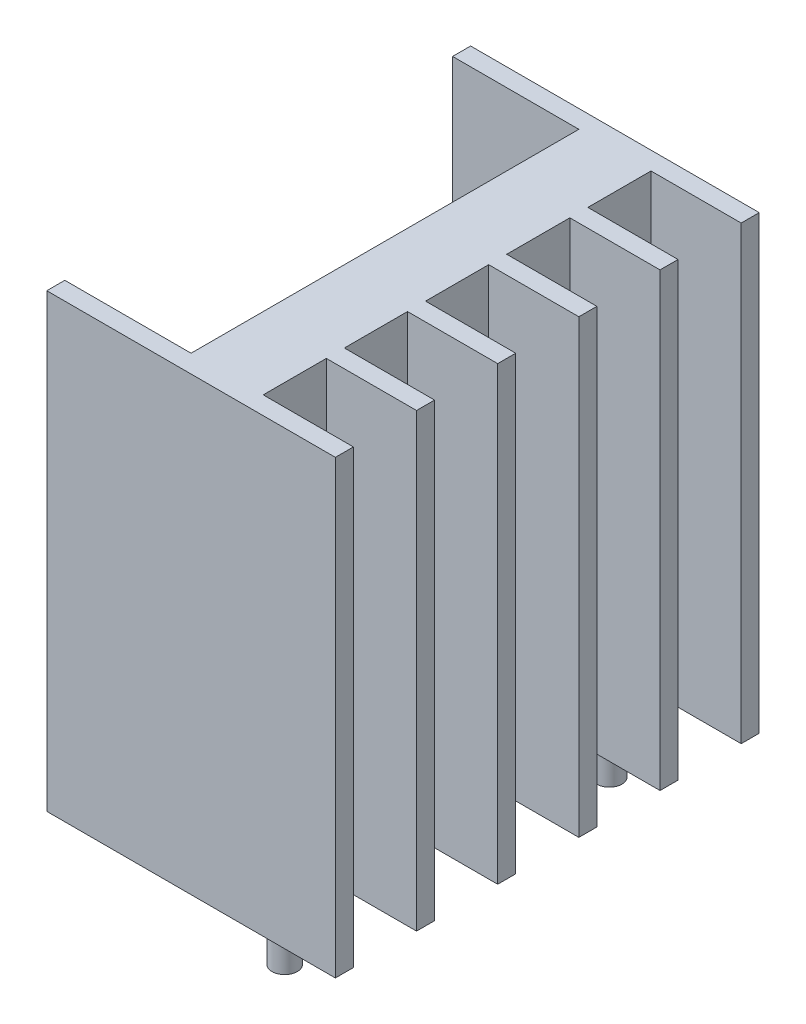
ISO-10303-21;
HEADER;
FILE_DESCRIPTION(('STEP AP214'),'2;1');
FILE_NAME('part.step','',(''),(''),'','','');
FILE_SCHEMA(('AUTOMOTIVE_DESIGN { 1 0 10303 214 1 1 1 1 }'));
ENDSEC;
DATA;
#1=APPLICATION_CONTEXT('core data for automotive mechanical design processes');
#2=APPLICATION_PROTOCOL_DEFINITION('international standard','automotive_design',2000,#1);
#3=PRODUCT_CONTEXT('',#1,'mechanical');
#4=PRODUCT('Part','Part','',(#3));
#5=PRODUCT_RELATED_PRODUCT_CATEGORY('part','',(#4));
#6=PRODUCT_DEFINITION_FORMATION('','',#4);
#7=PRODUCT_DEFINITION_CONTEXT('part definition',#1,'design');
#8=PRODUCT_DEFINITION('design','',#6,#7);
#9=PRODUCT_DEFINITION_SHAPE('','',#8);
#10=(LENGTH_UNIT() NAMED_UNIT(*) SI_UNIT(.MILLI.,.METRE.));
#11=(NAMED_UNIT(*) PLANE_ANGLE_UNIT() SI_UNIT($,.RADIAN.));
#12=(NAMED_UNIT(*) SI_UNIT($,.STERADIAN.) SOLID_ANGLE_UNIT());
#13=UNCERTAINTY_MEASURE_WITH_UNIT(LENGTH_MEASURE(1.E-05),#10,'distance_accuracy_value','');
#14=(GEOMETRIC_REPRESENTATION_CONTEXT(3) GLOBAL_UNCERTAINTY_ASSIGNED_CONTEXT((#13)) GLOBAL_UNIT_ASSIGNED_CONTEXT((#10,
#11,#12)) REPRESENTATION_CONTEXT('',''));
#15=CARTESIAN_POINT('',(0.,0.,0.));
#16=DIRECTION('',(0.,0.,1.));
#17=DIRECTION('',(1.,0.,0.));
#18=AXIS2_PLACEMENT_3D('',#15,#16,#17);
#19=CARTESIAN_POINT('',(2.,25.,-11.75));
#20=DIRECTION('',(-1.,0.,0.));
#21=DIRECTION('',(0.,0.,1.));
#22=AXIS2_PLACEMENT_3D('',#19,#20,#21);
#23=PLANE('',#22);
#24=DIRECTION('',(0.,0.,-1.));
#25=VECTOR('',#24,1.);
#26=CARTESIAN_POINT('',(2.,25.,-11.75));
#27=LINE('',#26,#25);
#28=CARTESIAN_POINT('',(2.,25.,6.25));
#29=VERTEX_POINT('',#28);
#30=CARTESIAN_POINT('',(2.,25.,2.75));
#31=VERTEX_POINT('',#30);
#32=EDGE_CURVE('E450',#29,#31,#27,.T.);
#33=ORIENTED_EDGE('',*,*,#32,.F.);
#34=DIRECTION('',(0.,1.,0.));
#35=VECTOR('',#34,1.);
#36=CARTESIAN_POINT('',(2.,-7.07106781186548,6.25));
#37=LINE('',#36,#35);
#38=CARTESIAN_POINT('',(2.,0.,6.25));
#39=VERTEX_POINT('',#38);
#40=EDGE_CURVE('E282',#39,#29,#37,.T.);
#41=ORIENTED_EDGE('',*,*,#40,.F.);
#42=DIRECTION('',(0.,0.,-1.));
#43=VECTOR('',#42,1.);
#44=CARTESIAN_POINT('',(2.,0.,-11.75));
#45=LINE('',#44,#43);
#46=CARTESIAN_POINT('',(2.,0.,2.75));
#47=VERTEX_POINT('',#46);
#48=EDGE_CURVE('E473',#39,#47,#45,.T.);
#49=ORIENTED_EDGE('',*,*,#48,.T.);
#50=DIRECTION('',(0.,1.,0.));
#51=VECTOR('',#50,1.);
#52=CARTESIAN_POINT('',(2.,-7.07106781186548,2.75));
#53=LINE('',#52,#51);
#54=EDGE_CURVE('E300',#47,#31,#53,.T.);
#55=ORIENTED_EDGE('',*,*,#54,.T.);
#56=EDGE_LOOP('',(#33,#41,#49,#55));
#57=FACE_BOUND('',#56,.T.);
#58=ADVANCED_FACE('F37',(#57),#23,.F.);
#59=CARTESIAN_POINT('',(2.,18.,0.));
#60=DIRECTION('',(-1.,0.,0.));
#61=DIRECTION('',(0.,0.,1.));
#62=AXIS2_PLACEMENT_3D('',#59,#60,#61);
#63=CIRCLE('',#62,1.6);
#64=CARTESIAN_POINT('',(2.,18.,1.6));
#65=VERTEX_POINT('',#64);
#66=EDGE_CURVE('E268',#65,#65,#63,.T.);
#67=ORIENTED_EDGE('',*,*,#66,.T.);
#68=EDGE_LOOP('',(#67));
#69=FACE_BOUND('',#68,.T.);
#70=CARTESIAN_POINT('',(2.,25.,1.75));
#71=VERTEX_POINT('',#70);
#72=CARTESIAN_POINT('',(2.,25.,-1.75));
#73=VERTEX_POINT('',#72);
#74=EDGE_CURVE('E466',#71,#73,#27,.T.);
#75=ORIENTED_EDGE('',*,*,#74,.F.);
#76=DIRECTION('',(0.,1.,0.));
#77=VECTOR('',#76,1.);
#78=CARTESIAN_POINT('',(2.,-7.07106781186548,1.75));
#79=LINE('',#78,#77);
#80=CARTESIAN_POINT('',(2.,0.,1.75));
#81=VERTEX_POINT('',#80);
#82=EDGE_CURVE('E308',#81,#71,#79,.T.);
#83=ORIENTED_EDGE('',*,*,#82,.F.);
#84=CARTESIAN_POINT('',(2.,0.,-1.75));
#85=VERTEX_POINT('',#84);
#86=EDGE_CURVE('E490',#81,#85,#45,.T.);
#87=ORIENTED_EDGE('',*,*,#86,.T.);
#88=DIRECTION('',(0.,1.,0.));
#89=VECTOR('',#88,1.);
#90=CARTESIAN_POINT('',(2.,-7.07106781186548,-1.75));
#91=LINE('',#90,#89);
#92=EDGE_CURVE('E326',#85,#73,#91,.T.);
#93=ORIENTED_EDGE('',*,*,#92,.T.);
#94=EDGE_LOOP('',(#75,#83,#87,#93));
#95=FACE_BOUND('',#94,.T.);
#96=ADVANCED_FACE('F489',(#69,#95),#23,.F.);
#97=CARTESIAN_POINT('',(2.,25.,-2.75));
#98=VERTEX_POINT('',#97);
#99=CARTESIAN_POINT('',(2.,25.,-6.25));
#100=VERTEX_POINT('',#99);
#101=EDGE_CURVE('E464',#98,#100,#27,.T.);
#102=ORIENTED_EDGE('',*,*,#101,.F.);
#103=DIRECTION('',(0.,1.,0.));
#104=VECTOR('',#103,1.);
#105=CARTESIAN_POINT('',(2.,-7.07106781186548,-2.75));
#106=LINE('',#105,#104);
#107=CARTESIAN_POINT('',(2.,0.,-2.75));
#108=VERTEX_POINT('',#107);
#109=EDGE_CURVE('E334',#108,#98,#106,.T.);
#110=ORIENTED_EDGE('',*,*,#109,.F.);
#111=CARTESIAN_POINT('',(2.,0.,-6.25));
#112=VERTEX_POINT('',#111);
#113=EDGE_CURVE('E507',#108,#112,#45,.T.);
#114=ORIENTED_EDGE('',*,*,#113,.T.);
#115=DIRECTION('',(0.,1.,0.));
#116=VECTOR('',#115,1.);
#117=CARTESIAN_POINT('',(2.,-7.07106781186548,-6.25));
#118=LINE('',#117,#116);
#119=EDGE_CURVE('E352',#112,#100,#118,.T.);
#120=ORIENTED_EDGE('',*,*,#119,.T.);
#121=EDGE_LOOP('',(#102,#110,#114,#120));
#122=FACE_BOUND('',#121,.T.);
#123=ADVANCED_FACE('F506',(#122),#23,.F.);
#124=CARTESIAN_POINT('',(2.,25.,-7.25));
#125=VERTEX_POINT('',#124);
#126=CARTESIAN_POINT('',(2.,25.,-10.75));
#127=VERTEX_POINT('',#126);
#128=EDGE_CURVE('E451',#125,#127,#27,.T.);
#129=ORIENTED_EDGE('',*,*,#128,.F.);
#130=DIRECTION('',(0.,1.,0.));
#131=VECTOR('',#130,1.);
#132=CARTESIAN_POINT('',(2.,-7.07106781186548,-7.25));
#133=LINE('',#132,#131);
#134=CARTESIAN_POINT('',(2.,0.,-7.25));
#135=VERTEX_POINT('',#134);
#136=EDGE_CURVE('E360',#135,#125,#133,.T.);
#137=ORIENTED_EDGE('',*,*,#136,.F.);
#138=CARTESIAN_POINT('',(2.,0.,-8.58165069778209));
#139=VERTEX_POINT('',#138);
#140=EDGE_CURVE('E238',#135,#139,#45,.T.);
#141=ORIENTED_EDGE('',*,*,#140,.T.);
#142=CARTESIAN_POINT('',(2.,0.,-9.4183493022179));
#143=VERTEX_POINT('',#142);
#144=EDGE_CURVE('E232',#139,#143,#45,.T.);
#145=ORIENTED_EDGE('',*,*,#144,.T.);
#146=CARTESIAN_POINT('',(2.,0.,-10.75));
#147=VERTEX_POINT('',#146);
#148=EDGE_CURVE('E235',#143,#147,#45,.T.);
#149=ORIENTED_EDGE('',*,*,#148,.T.);
#150=DIRECTION('',(0.,1.,0.));
#151=VECTOR('',#150,1.);
#152=CARTESIAN_POINT('',(2.,-7.07106781186548,-10.75));
#153=LINE('',#152,#151);
#154=EDGE_CURVE('E376',#147,#127,#153,.T.);
#155=ORIENTED_EDGE('',*,*,#154,.T.);
#156=EDGE_LOOP('',(#129,#137,#141,#145,#149,#155));
#157=FACE_BOUND('',#156,.T.);
#158=ADVANCED_FACE('F233',(#157),#23,.F.);
#159=CARTESIAN_POINT('',(2.,0.,10.75));
#160=VERTEX_POINT('',#159);
#161=CARTESIAN_POINT('',(2.,0.,9.4183493022179));
#162=VERTEX_POINT('',#161);
#163=EDGE_CURVE('E249',#160,#162,#45,.T.);
#164=ORIENTED_EDGE('',*,*,#163,.T.);
#165=CARTESIAN_POINT('',(2.,0.,8.5816506977821));
#166=VERTEX_POINT('',#165);
#167=EDGE_CURVE('E458',#162,#166,#45,.T.);
#168=ORIENTED_EDGE('',*,*,#167,.T.);
#169=CARTESIAN_POINT('',(2.,0.,7.25));
#170=VERTEX_POINT('',#169);
#171=EDGE_CURVE('E243',#166,#170,#45,.T.);
#172=ORIENTED_EDGE('',*,*,#171,.T.);
#173=DIRECTION('',(0.,1.,0.));
#174=VECTOR('',#173,1.);
#175=CARTESIAN_POINT('',(2.,-7.07106781186548,7.25));
#176=LINE('',#175,#174);
#177=CARTESIAN_POINT('',(2.,25.,7.25));
#178=VERTEX_POINT('',#177);
#179=EDGE_CURVE('E275',#170,#178,#176,.T.);
#180=ORIENTED_EDGE('',*,*,#179,.T.);
#181=CARTESIAN_POINT('',(2.,25.,10.75));
#182=VERTEX_POINT('',#181);
#183=EDGE_CURVE('E446',#182,#178,#27,.T.);
#184=ORIENTED_EDGE('',*,*,#183,.F.);
#185=DIRECTION('',(0.,1.,0.));
#186=VECTOR('',#185,1.);
#187=CARTESIAN_POINT('',(2.,-7.07106781186548,10.75));
#188=LINE('',#187,#186);
#189=EDGE_CURVE('E432',#160,#182,#188,.T.);
#190=ORIENTED_EDGE('',*,*,#189,.F.);
#191=EDGE_LOOP('',(#164,#168,#172,#180,#184,#190));
#192=FACE_BOUND('',#191,.T.);
#193=ADVANCED_FACE('F39',(#192),#23,.F.);
#194=CARTESIAN_POINT('',(-2.,25.,-11.75));
#195=DIRECTION('',(0.,0.,1.));
#196=DIRECTION('',(1.,0.,0.));
#197=AXIS2_PLACEMENT_3D('',#194,#195,#196);
#198=PLANE('',#197);
#199=DIRECTION('',(-1.,0.,0.));
#200=VECTOR('',#199,1.);
#201=CARTESIAN_POINT('',(-2.,0.,-11.75));
#202=LINE('',#201,#200);
#203=CARTESIAN_POINT('',(7.,0.,-11.75));
#204=VERTEX_POINT('',#203);
#205=CARTESIAN_POINT('',(-9.,0.,-11.75));
#206=VERTEX_POINT('',#205);
#207=EDGE_CURVE('E457',#204,#206,#202,.T.);
#208=ORIENTED_EDGE('',*,*,#207,.T.);
#209=DIRECTION('',(0.,1.,0.));
#210=VECTOR('',#209,1.);
#211=CARTESIAN_POINT('',(-9.,-7.07106781186548,-11.75));
#212=LINE('',#211,#210);
#213=CARTESIAN_POINT('',(-9.,25.,-11.75));
#214=VERTEX_POINT('',#213);
#215=EDGE_CURVE('E391',#206,#214,#212,.T.);
#216=ORIENTED_EDGE('',*,*,#215,.T.);
#217=DIRECTION('',(-1.,0.,0.));
#218=VECTOR('',#217,1.);
#219=CARTESIAN_POINT('',(-2.,25.,-11.75));
#220=LINE('',#219,#218);
#221=CARTESIAN_POINT('',(7.,25.,-11.75));
#222=VERTEX_POINT('',#221);
#223=EDGE_CURVE('E449',#222,#214,#220,.T.);
#224=ORIENTED_EDGE('',*,*,#223,.F.);
#225=DIRECTION('',(0.,1.,0.));
#226=VECTOR('',#225,1.);
#227=CARTESIAN_POINT('',(7.,-7.07106781186548,-11.75));
#228=LINE('',#227,#226);
#229=EDGE_CURVE('E381',#204,#222,#228,.T.);
#230=ORIENTED_EDGE('',*,*,#229,.F.);
#231=EDGE_LOOP('',(#208,#216,#224,#230));
#232=FACE_BOUND('',#231,.T.);
#233=ADVANCED_FACE('F531',(#232),#198,.F.);
#234=CARTESIAN_POINT('',(-2.,25.,-11.75));
#235=DIRECTION('',(1.,0.,0.));
#236=DIRECTION('',(0.,0.,-1.));
#237=AXIS2_PLACEMENT_3D('',#234,#235,#236);
#238=PLANE('',#237);
#239=CARTESIAN_POINT('',(-2.,18.,0.));
#240=DIRECTION('',(-1.,0.,0.));
#241=DIRECTION('',(0.,0.,1.));
#242=AXIS2_PLACEMENT_3D('',#239,#240,#241);
#243=CIRCLE('',#242,1.6);
#244=CARTESIAN_POINT('',(-2.,18.,1.6));
#245=VERTEX_POINT('',#244);
#246=EDGE_CURVE('E264',#245,#245,#243,.T.);
#247=ORIENTED_EDGE('',*,*,#246,.F.);
#248=EDGE_LOOP('',(#247));
#249=FACE_BOUND('',#248,.T.);
#250=DIRECTION('',(0.,0.,1.));
#251=VECTOR('',#250,1.);
#252=CARTESIAN_POINT('',(-2.,25.,-11.75));
#253=LINE('',#252,#251);
#254=CARTESIAN_POINT('',(-2.,25.,-10.75));
#255=VERTEX_POINT('',#254);
#256=CARTESIAN_POINT('',(-2.,25.,10.75));
#257=VERTEX_POINT('',#256);
#258=EDGE_CURVE('E453',#255,#257,#253,.T.);
#259=ORIENTED_EDGE('',*,*,#258,.F.);
#260=DIRECTION('',(0.,1.,0.));
#261=VECTOR('',#260,1.);
#262=CARTESIAN_POINT('',(-2.,-7.07106781186548,-10.75));
#263=LINE('',#262,#261);
#264=CARTESIAN_POINT('',(-2.,0.,-10.75));
#265=VERTEX_POINT('',#264);
#266=EDGE_CURVE('E397',#265,#255,#263,.T.);
#267=ORIENTED_EDGE('',*,*,#266,.F.);
#268=DIRECTION('',(0.,0.,1.));
#269=VECTOR('',#268,1.);
#270=CARTESIAN_POINT('',(-2.,0.,-11.75));
#271=LINE('',#270,#269);
#272=CARTESIAN_POINT('',(-2.,0.,10.75));
#273=VERTEX_POINT('',#272);
#274=EDGE_CURVE('E460',#265,#273,#271,.T.);
#275=ORIENTED_EDGE('',*,*,#274,.T.);
#276=DIRECTION('',(0.,1.,0.));
#277=VECTOR('',#276,1.);
#278=CARTESIAN_POINT('',(-2.,-7.07106781186548,10.75));
#279=LINE('',#278,#277);
#280=EDGE_CURVE('E413',#273,#257,#279,.T.);
#281=ORIENTED_EDGE('',*,*,#280,.T.);
#282=EDGE_LOOP('',(#259,#267,#275,#281));
#283=FACE_BOUND('',#282,.T.);
#284=ADVANCED_FACE('F544',(#249,#283),#238,.F.);
#285=CARTESIAN_POINT('',(-2.,25.,11.75));
#286=DIRECTION('',(0.,0.,-1.));
#287=DIRECTION('',(-1.,0.,0.));
#288=AXIS2_PLACEMENT_3D('',#285,#286,#287);
#289=PLANE('',#288);
#290=DIRECTION('',(1.,0.,0.));
#291=VECTOR('',#290,1.);
#292=CARTESIAN_POINT('',(-2.,0.,11.75));
#293=LINE('',#292,#291);
#294=CARTESIAN_POINT('',(-9.,0.,11.75));
#295=VERTEX_POINT('',#294);
#296=CARTESIAN_POINT('',(7.,0.,11.75));
#297=VERTEX_POINT('',#296);
#298=EDGE_CURVE('E461',#295,#297,#293,.T.);
#299=ORIENTED_EDGE('',*,*,#298,.T.);
#300=DIRECTION('',(0.,1.,0.));
#301=VECTOR('',#300,1.);
#302=CARTESIAN_POINT('',(7.,-7.07106781186548,11.75));
#303=LINE('',#302,#301);
#304=CARTESIAN_POINT('',(7.,25.,11.75));
#305=VERTEX_POINT('',#304);
#306=EDGE_CURVE('E439',#297,#305,#303,.T.);
#307=ORIENTED_EDGE('',*,*,#306,.T.);
#308=DIRECTION('',(1.,0.,0.));
#309=VECTOR('',#308,1.);
#310=CARTESIAN_POINT('',(-2.,25.,11.75));
#311=LINE('',#310,#309);
#312=CARTESIAN_POINT('',(-9.,25.,11.75));
#313=VERTEX_POINT('',#312);
#314=EDGE_CURVE('E455',#313,#305,#311,.T.);
#315=ORIENTED_EDGE('',*,*,#314,.F.);
#316=DIRECTION('',(0.,1.,0.));
#317=VECTOR('',#316,1.);
#318=CARTESIAN_POINT('',(-9.,-7.07106781186548,11.75));
#319=LINE('',#318,#317);
#320=EDGE_CURVE('E419',#295,#313,#319,.T.);
#321=ORIENTED_EDGE('',*,*,#320,.F.);
#322=EDGE_LOOP('',(#299,#307,#315,#321));
#323=FACE_BOUND('',#322,.T.);
#324=ADVANCED_FACE('F558',(#323),#289,.F.);
#325=CARTESIAN_POINT('',(0.,25.,0.));
#326=DIRECTION('',(0.,1.,0.));
#327=DIRECTION('',(0.,0.,1.));
#328=AXIS2_PLACEMENT_3D('',#325,#326,#327);
#329=PLANE('',#328);
#330=ORIENTED_EDGE('',*,*,#314,.T.);
#331=DIRECTION('',(0.,0.,-1.));
#332=VECTOR('',#331,1.);
#333=CARTESIAN_POINT('',(7.,25.,11.75));
#334=LINE('',#333,#332);
#335=CARTESIAN_POINT('',(7.,25.,10.75));
#336=VERTEX_POINT('',#335);
#337=EDGE_CURVE('E427',#305,#336,#334,.T.);
#338=ORIENTED_EDGE('',*,*,#337,.T.);
#339=DIRECTION('',(-1.,0.,0.));
#340=VECTOR('',#339,1.);
#341=CARTESIAN_POINT('',(2.,25.,10.75));
#342=LINE('',#341,#340);
#343=EDGE_CURVE('E436',#336,#182,#342,.T.);
#344=ORIENTED_EDGE('',*,*,#343,.T.);
#345=ORIENTED_EDGE('',*,*,#183,.T.);
#346=DIRECTION('',(1.,0.,0.));
#347=VECTOR('',#346,1.);
#348=CARTESIAN_POINT('',(2.,25.,7.25));
#349=LINE('',#348,#347);
#350=CARTESIAN_POINT('',(7.,25.,7.25));
#351=VERTEX_POINT('',#350);
#352=EDGE_CURVE('E291',#178,#351,#349,.T.);
#353=ORIENTED_EDGE('',*,*,#352,.T.);
#354=DIRECTION('',(0.,0.,-1.));
#355=VECTOR('',#354,1.);
#356=CARTESIAN_POINT('',(7.,25.,6.25));
#357=LINE('',#356,#355);
#358=CARTESIAN_POINT('',(7.,25.,6.25));
#359=VERTEX_POINT('',#358);
#360=EDGE_CURVE('E288',#351,#359,#357,.T.);
#361=ORIENTED_EDGE('',*,*,#360,.T.);
#362=DIRECTION('',(-1.,0.,0.));
#363=VECTOR('',#362,1.);
#364=CARTESIAN_POINT('',(2.,25.,6.25));
#365=LINE('',#364,#363);
#366=EDGE_CURVE('E277',#359,#29,#365,.T.);
#367=ORIENTED_EDGE('',*,*,#366,.T.);
#368=ORIENTED_EDGE('',*,*,#32,.T.);
#369=DIRECTION('',(1.,0.,0.));
#370=VECTOR('',#369,1.);
#371=CARTESIAN_POINT('',(2.,25.,2.75));
#372=LINE('',#371,#370);
#373=CARTESIAN_POINT('',(7.,25.,2.75));
#374=VERTEX_POINT('',#373);
#375=EDGE_CURVE('E317',#31,#374,#372,.T.);
#376=ORIENTED_EDGE('',*,*,#375,.T.);
#377=DIRECTION('',(0.,0.,-1.));
#378=VECTOR('',#377,1.);
#379=CARTESIAN_POINT('',(7.,25.,1.75));
#380=LINE('',#379,#378);
#381=CARTESIAN_POINT('',(7.,25.,1.75));
#382=VERTEX_POINT('',#381);
#383=EDGE_CURVE('E314',#374,#382,#380,.T.);
#384=ORIENTED_EDGE('',*,*,#383,.T.);
#385=DIRECTION('',(-1.,0.,0.));
#386=VECTOR('',#385,1.);
#387=CARTESIAN_POINT('',(2.,25.,1.75));
#388=LINE('',#387,#386);
#389=EDGE_CURVE('E303',#382,#71,#388,.T.);
#390=ORIENTED_EDGE('',*,*,#389,.T.);
#391=ORIENTED_EDGE('',*,*,#74,.T.);
#392=DIRECTION('',(1.,0.,0.));
#393=VECTOR('',#392,1.);
#394=CARTESIAN_POINT('',(2.,25.,-1.75));
#395=LINE('',#394,#393);
#396=CARTESIAN_POINT('',(7.,25.,-1.75));
#397=VERTEX_POINT('',#396);
#398=EDGE_CURVE('E343',#73,#397,#395,.T.);
#399=ORIENTED_EDGE('',*,*,#398,.T.);
#400=DIRECTION('',(0.,0.,-1.));
#401=VECTOR('',#400,1.);
#402=CARTESIAN_POINT('',(7.,25.,-2.75));
#403=LINE('',#402,#401);
#404=CARTESIAN_POINT('',(7.,25.,-2.75));
#405=VERTEX_POINT('',#404);
#406=EDGE_CURVE('E340',#397,#405,#403,.T.);
#407=ORIENTED_EDGE('',*,*,#406,.T.);
#408=DIRECTION('',(-1.,0.,0.));
#409=VECTOR('',#408,1.);
#410=CARTESIAN_POINT('',(2.,25.,-2.75));
#411=LINE('',#410,#409);
#412=EDGE_CURVE('E329',#405,#98,#411,.T.);
#413=ORIENTED_EDGE('',*,*,#412,.T.);
#414=ORIENTED_EDGE('',*,*,#101,.T.);
#415=DIRECTION('',(1.,0.,0.));
#416=VECTOR('',#415,1.);
#417=CARTESIAN_POINT('',(2.,25.,-6.25));
#418=LINE('',#417,#416);
#419=CARTESIAN_POINT('',(7.,25.,-6.25));
#420=VERTEX_POINT('',#419);
#421=EDGE_CURVE('E369',#100,#420,#418,.T.);
#422=ORIENTED_EDGE('',*,*,#421,.T.);
#423=DIRECTION('',(0.,0.,-1.));
#424=VECTOR('',#423,1.);
#425=CARTESIAN_POINT('',(7.,25.,-7.25));
#426=LINE('',#425,#424);
#427=CARTESIAN_POINT('',(7.,25.,-7.25));
#428=VERTEX_POINT('',#427);
#429=EDGE_CURVE('E366',#420,#428,#426,.T.);
#430=ORIENTED_EDGE('',*,*,#429,.T.);
#431=DIRECTION('',(-1.,0.,0.));
#432=VECTOR('',#431,1.);
#433=CARTESIAN_POINT('',(2.,25.,-7.25));
#434=LINE('',#433,#432);
#435=EDGE_CURVE('E355',#428,#125,#434,.T.);
#436=ORIENTED_EDGE('',*,*,#435,.T.);
#437=ORIENTED_EDGE('',*,*,#128,.T.);
#438=DIRECTION('',(1.,0.,0.));
#439=VECTOR('',#438,1.);
#440=CARTESIAN_POINT('',(2.,25.,-10.75));
#441=LINE('',#440,#439);
#442=CARTESIAN_POINT('',(7.,25.,-10.75));
#443=VERTEX_POINT('',#442);
#444=EDGE_CURVE('E386',#127,#443,#441,.T.);
#445=ORIENTED_EDGE('',*,*,#444,.T.);
#446=DIRECTION('',(0.,0.,-1.));
#447=VECTOR('',#446,1.);
#448=CARTESIAN_POINT('',(7.,25.,-11.75));
#449=LINE('',#448,#447);
#450=EDGE_CURVE('E378',#443,#222,#449,.T.);
#451=ORIENTED_EDGE('',*,*,#450,.T.);
#452=ORIENTED_EDGE('',*,*,#223,.T.);
#453=DIRECTION('',(0.,0.,1.));
#454=VECTOR('',#453,1.);
#455=CARTESIAN_POINT('',(-9.,25.,-11.75));
#456=LINE('',#455,#454);
#457=CARTESIAN_POINT('',(-9.,25.,-10.75));
#458=VERTEX_POINT('',#457);
#459=EDGE_CURVE('E403',#214,#458,#456,.T.);
#460=ORIENTED_EDGE('',*,*,#459,.T.);
#461=DIRECTION('',(1.,0.,0.));
#462=VECTOR('',#461,1.);
#463=CARTESIAN_POINT('',(-2.,25.,-10.75));
#464=LINE('',#463,#462);
#465=EDGE_CURVE('E394',#458,#255,#464,.T.);
#466=ORIENTED_EDGE('',*,*,#465,.T.);
#467=ORIENTED_EDGE('',*,*,#258,.T.);
#468=DIRECTION('',(-1.,0.,0.));
#469=VECTOR('',#468,1.);
#470=CARTESIAN_POINT('',(-2.,25.,10.75));
#471=LINE('',#470,#469);
#472=CARTESIAN_POINT('',(-9.,25.,10.75));
#473=VERTEX_POINT('',#472);
#474=EDGE_CURVE('E424',#257,#473,#471,.T.);
#475=ORIENTED_EDGE('',*,*,#474,.T.);
#476=DIRECTION('',(0.,0.,1.));
#477=VECTOR('',#476,1.);
#478=CARTESIAN_POINT('',(-9.,25.,11.75));
#479=LINE('',#478,#477);
#480=EDGE_CURVE('E416',#473,#313,#479,.T.);
#481=ORIENTED_EDGE('',*,*,#480,.T.);
#482=EDGE_LOOP('',(#330,#338,#344,#345,#353,#361,#367,#368,#376,#384,#390,#391,#399,#407,#413,
#414,#422,#430,#436,#437,#445,#451,#452,#460,#466,#467,#475,#481));
#483=FACE_BOUND('',#482,.T.);
#484=ADVANCED_FACE('F467',(#483),#329,.T.);
#485=CARTESIAN_POINT('',(0.,0.,0.));
#486=DIRECTION('',(0.,1.,0.));
#487=DIRECTION('',(0.,0.,1.));
#488=AXIS2_PLACEMENT_3D('',#485,#486,#487);
#489=PLANE('',#488);
#490=CARTESIAN_POINT('',(1.43876576963464,0.,-9.));
#491=DIRECTION('',(0.,1.,0.));
#492=DIRECTION('',(0.,0.,1.));
#493=AXIS2_PLACEMENT_3D('',#490,#491,#492);
#494=CIRCLE('',#493,0.7);
#495=EDGE_CURVE('E11',#139,#143,#494,.F.);
#496=ORIENTED_EDGE('',*,*,#495,.F.);
#497=ORIENTED_EDGE('',*,*,#140,.F.);
#498=DIRECTION('',(1.,0.,0.));
#499=VECTOR('',#498,1.);
#500=CARTESIAN_POINT('',(2.,0.,-7.25));
#501=LINE('',#500,#499);
#502=CARTESIAN_POINT('',(7.,0.,-7.25));
#503=VERTEX_POINT('',#502);
#504=EDGE_CURVE('E351',#135,#503,#501,.T.);
#505=ORIENTED_EDGE('',*,*,#504,.T.);
#506=DIRECTION('',(0.,0.,1.));
#507=VECTOR('',#506,1.);
#508=CARTESIAN_POINT('',(7.,0.,-7.25));
#509=LINE('',#508,#507);
#510=CARTESIAN_POINT('',(7.,0.,-6.25));
#511=VERTEX_POINT('',#510);
#512=EDGE_CURVE('E363',#503,#511,#509,.T.);
#513=ORIENTED_EDGE('',*,*,#512,.T.);
#514=DIRECTION('',(-1.,0.,0.));
#515=VECTOR('',#514,1.);
#516=CARTESIAN_POINT('',(2.,0.,-6.25));
#517=LINE('',#516,#515);
#518=EDGE_CURVE('E346',#511,#112,#517,.T.);
#519=ORIENTED_EDGE('',*,*,#518,.T.);
#520=ORIENTED_EDGE('',*,*,#113,.F.);
#521=DIRECTION('',(1.,0.,0.));
#522=VECTOR('',#521,1.);
#523=CARTESIAN_POINT('',(2.,0.,-2.75));
#524=LINE('',#523,#522);
#525=CARTESIAN_POINT('',(7.,0.,-2.75));
#526=VERTEX_POINT('',#525);
#527=EDGE_CURVE('E325',#108,#526,#524,.T.);
#528=ORIENTED_EDGE('',*,*,#527,.T.);
#529=DIRECTION('',(0.,0.,1.));
#530=VECTOR('',#529,1.);
#531=CARTESIAN_POINT('',(7.,0.,-2.75));
#532=LINE('',#531,#530);
#533=CARTESIAN_POINT('',(7.,0.,-1.75));
#534=VERTEX_POINT('',#533);
#535=EDGE_CURVE('E337',#526,#534,#532,.T.);
#536=ORIENTED_EDGE('',*,*,#535,.T.);
#537=DIRECTION('',(-1.,0.,0.));
#538=VECTOR('',#537,1.);
#539=CARTESIAN_POINT('',(2.,0.,-1.75));
#540=LINE('',#539,#538);
#541=EDGE_CURVE('E320',#534,#85,#540,.T.);
#542=ORIENTED_EDGE('',*,*,#541,.T.);
#543=ORIENTED_EDGE('',*,*,#86,.F.);
#544=DIRECTION('',(1.,0.,0.));
#545=VECTOR('',#544,1.);
#546=CARTESIAN_POINT('',(2.,0.,1.75));
#547=LINE('',#546,#545);
#548=CARTESIAN_POINT('',(7.,0.,1.75));
#549=VERTEX_POINT('',#548);
#550=EDGE_CURVE('E299',#81,#549,#547,.T.);
#551=ORIENTED_EDGE('',*,*,#550,.T.);
#552=DIRECTION('',(0.,0.,1.));
#553=VECTOR('',#552,1.);
#554=CARTESIAN_POINT('',(7.,0.,1.75));
#555=LINE('',#554,#553);
#556=CARTESIAN_POINT('',(7.,0.,2.75));
#557=VERTEX_POINT('',#556);
#558=EDGE_CURVE('E311',#549,#557,#555,.T.);
#559=ORIENTED_EDGE('',*,*,#558,.T.);
#560=DIRECTION('',(-1.,0.,0.));
#561=VECTOR('',#560,1.);
#562=CARTESIAN_POINT('',(2.,0.,2.75));
#563=LINE('',#562,#561);
#564=EDGE_CURVE('E294',#557,#47,#563,.T.);
#565=ORIENTED_EDGE('',*,*,#564,.T.);
#566=ORIENTED_EDGE('',*,*,#48,.F.);
#567=DIRECTION('',(1.,0.,0.));
#568=VECTOR('',#567,1.);
#569=CARTESIAN_POINT('',(2.,0.,6.25));
#570=LINE('',#569,#568);
#571=CARTESIAN_POINT('',(7.,0.,6.25));
#572=VERTEX_POINT('',#571);
#573=EDGE_CURVE('E274',#39,#572,#570,.T.);
#574=ORIENTED_EDGE('',*,*,#573,.T.);
#575=DIRECTION('',(0.,0.,1.));
#576=VECTOR('',#575,1.);
#577=CARTESIAN_POINT('',(7.,0.,6.25));
#578=LINE('',#577,#576);
#579=CARTESIAN_POINT('',(7.,0.,7.25));
#580=VERTEX_POINT('',#579);
#581=EDGE_CURVE('E285',#572,#580,#578,.T.);
#582=ORIENTED_EDGE('',*,*,#581,.T.);
#583=DIRECTION('',(-1.,0.,0.));
#584=VECTOR('',#583,1.);
#585=CARTESIAN_POINT('',(2.,0.,7.25));
#586=LINE('',#585,#584);
#587=EDGE_CURVE('E271',#580,#170,#586,.T.);
#588=ORIENTED_EDGE('',*,*,#587,.T.);
#589=ORIENTED_EDGE('',*,*,#171,.F.);
#590=CARTESIAN_POINT('',(1.43876576963464,0.,9.));
#591=DIRECTION('',(0.,-1.,0.));
#592=DIRECTION('',(0.,0.,-1.));
#593=AXIS2_PLACEMENT_3D('',#590,#591,#592);
#594=CIRCLE('',#593,0.7);
#595=EDGE_CURVE('E45',#162,#166,#594,.T.);
#596=ORIENTED_EDGE('',*,*,#595,.F.);
#597=ORIENTED_EDGE('',*,*,#163,.F.);
#598=DIRECTION('',(1.,0.,0.));
#599=VECTOR('',#598,1.);
#600=CARTESIAN_POINT('',(2.,0.,10.75));
#601=LINE('',#600,#599);
#602=CARTESIAN_POINT('',(7.,0.,10.75));
#603=VERTEX_POINT('',#602);
#604=EDGE_CURVE('E248',#160,#603,#601,.T.);
#605=ORIENTED_EDGE('',*,*,#604,.T.);
#606=DIRECTION('',(0.,0.,1.));
#607=VECTOR('',#606,1.);
#608=CARTESIAN_POINT('',(7.,0.,11.75));
#609=LINE('',#608,#607);
#610=EDGE_CURVE('E429',#603,#297,#609,.T.);
#611=ORIENTED_EDGE('',*,*,#610,.T.);
#612=ORIENTED_EDGE('',*,*,#298,.F.);
#613=DIRECTION('',(0.,0.,-1.));
#614=VECTOR('',#613,1.);
#615=CARTESIAN_POINT('',(-9.,0.,11.75));
#616=LINE('',#615,#614);
#617=CARTESIAN_POINT('',(-9.,0.,10.75));
#618=VERTEX_POINT('',#617);
#619=EDGE_CURVE('E412',#295,#618,#616,.T.);
#620=ORIENTED_EDGE('',*,*,#619,.T.);
#621=DIRECTION('',(1.,0.,0.));
#622=VECTOR('',#621,1.);
#623=CARTESIAN_POINT('',(-2.,0.,10.75));
#624=LINE('',#623,#622);
#625=EDGE_CURVE('E406',#618,#273,#624,.T.);
#626=ORIENTED_EDGE('',*,*,#625,.T.);
#627=ORIENTED_EDGE('',*,*,#274,.F.);
#628=DIRECTION('',(-1.,0.,0.));
#629=VECTOR('',#628,1.);
#630=CARTESIAN_POINT('',(-2.,0.,-10.75));
#631=LINE('',#630,#629);
#632=CARTESIAN_POINT('',(-9.,0.,-10.75));
#633=VERTEX_POINT('',#632);
#634=EDGE_CURVE('E389',#265,#633,#631,.T.);
#635=ORIENTED_EDGE('',*,*,#634,.T.);
#636=DIRECTION('',(0.,0.,-1.));
#637=VECTOR('',#636,1.);
#638=CARTESIAN_POINT('',(-9.,0.,-11.75));
#639=LINE('',#638,#637);
#640=EDGE_CURVE('E400',#633,#206,#639,.T.);
#641=ORIENTED_EDGE('',*,*,#640,.T.);
#642=ORIENTED_EDGE('',*,*,#207,.F.);
#643=DIRECTION('',(0.,0.,1.));
#644=VECTOR('',#643,1.);
#645=CARTESIAN_POINT('',(7.,0.,-11.75));
#646=LINE('',#645,#644);
#647=CARTESIAN_POINT('',(7.,0.,-10.75));
#648=VERTEX_POINT('',#647);
#649=EDGE_CURVE('E375',#204,#648,#646,.T.);
#650=ORIENTED_EDGE('',*,*,#649,.T.);
#651=DIRECTION('',(-1.,0.,0.));
#652=VECTOR('',#651,1.);
#653=CARTESIAN_POINT('',(2.,0.,-10.75));
#654=LINE('',#653,#652);
#655=EDGE_CURVE('E246',#648,#147,#654,.T.);
#656=ORIENTED_EDGE('',*,*,#655,.T.);
#657=ORIENTED_EDGE('',*,*,#148,.F.);
#658=EDGE_LOOP('',(#496,#497,#505,#513,#519,#520,#528,#536,#542,#543,#551,#559,#565,#566,#574,
#582,#588,#589,#596,#597,#605,#611,#612,#620,#626,#627,#635,#641,#642,#650,#656,#657));
#659=FACE_BOUND('',#658,.T.);
#660=ADVANCED_FACE('F244',(#659),#489,.F.);
#661=CARTESIAN_POINT('',(2.,-7.07106781186548,10.75));
#662=DIRECTION('',(0.,0.,-1.));
#663=DIRECTION('',(-1.,0.,0.));
#664=AXIS2_PLACEMENT_3D('',#661,#662,#663);
#665=PLANE('',#664);
#666=ORIENTED_EDGE('',*,*,#604,.F.);
#667=ORIENTED_EDGE('',*,*,#189,.T.);
#668=ORIENTED_EDGE('',*,*,#343,.F.);
#669=DIRECTION('',(0.,1.,0.));
#670=VECTOR('',#669,1.);
#671=CARTESIAN_POINT('',(7.,-7.07106781186548,10.75));
#672=LINE('',#671,#670);
#673=EDGE_CURVE('E442',#603,#336,#672,.T.);
#674=ORIENTED_EDGE('',*,*,#673,.F.);
#675=EDGE_LOOP('',(#666,#667,#668,#674));
#676=FACE_BOUND('',#675,.T.);
#677=ADVANCED_FACE('F565',(#676),#665,.T.);
#678=CARTESIAN_POINT('',(7.,-7.07106781186548,11.75));
#679=DIRECTION('',(1.,0.,0.));
#680=DIRECTION('',(0.,0.,-1.));
#681=AXIS2_PLACEMENT_3D('',#678,#679,#680);
#682=PLANE('',#681);
#683=ORIENTED_EDGE('',*,*,#610,.F.);
#684=ORIENTED_EDGE('',*,*,#673,.T.);
#685=ORIENTED_EDGE('',*,*,#337,.F.);
#686=ORIENTED_EDGE('',*,*,#306,.F.);
#687=EDGE_LOOP('',(#683,#684,#685,#686));
#688=FACE_BOUND('',#687,.T.);
#689=ADVANCED_FACE('F561',(#688),#682,.T.);
#690=CARTESIAN_POINT('',(-9.,-7.07106781186548,11.75));
#691=DIRECTION('',(-1.,0.,0.));
#692=DIRECTION('',(0.,0.,1.));
#693=AXIS2_PLACEMENT_3D('',#690,#691,#692);
#694=PLANE('',#693);
#695=ORIENTED_EDGE('',*,*,#619,.F.);
#696=ORIENTED_EDGE('',*,*,#320,.T.);
#697=ORIENTED_EDGE('',*,*,#480,.F.);
#698=DIRECTION('',(0.,1.,0.));
#699=VECTOR('',#698,1.);
#700=CARTESIAN_POINT('',(-9.,-7.07106781186548,10.75));
#701=LINE('',#700,#699);
#702=EDGE_CURVE('E417',#618,#473,#701,.T.);
#703=ORIENTED_EDGE('',*,*,#702,.F.);
#704=EDGE_LOOP('',(#695,#696,#697,#703));
#705=FACE_BOUND('',#704,.T.);
#706=ADVANCED_FACE('F554',(#705),#694,.T.);
#707=CARTESIAN_POINT('',(-2.,-7.07106781186548,10.75));
#708=DIRECTION('',(0.,0.,-1.));
#709=DIRECTION('',(-1.,0.,0.));
#710=AXIS2_PLACEMENT_3D('',#707,#708,#709);
#711=PLANE('',#710);
#712=ORIENTED_EDGE('',*,*,#625,.F.);
#713=ORIENTED_EDGE('',*,*,#702,.T.);
#714=ORIENTED_EDGE('',*,*,#474,.F.);
#715=ORIENTED_EDGE('',*,*,#280,.F.);
#716=EDGE_LOOP('',(#712,#713,#714,#715));
#717=FACE_BOUND('',#716,.T.);
#718=ADVANCED_FACE('F549',(#717),#711,.T.);
#719=CARTESIAN_POINT('',(-2.,-7.07106781186548,-10.75));
#720=DIRECTION('',(0.,0.,1.));
#721=DIRECTION('',(1.,0.,0.));
#722=AXIS2_PLACEMENT_3D('',#719,#720,#721);
#723=PLANE('',#722);
#724=ORIENTED_EDGE('',*,*,#634,.F.);
#725=ORIENTED_EDGE('',*,*,#266,.T.);
#726=ORIENTED_EDGE('',*,*,#465,.F.);
#727=DIRECTION('',(0.,1.,0.));
#728=VECTOR('',#727,1.);
#729=CARTESIAN_POINT('',(-9.,-7.07106781186548,-10.75));
#730=LINE('',#729,#728);
#731=EDGE_CURVE('E395',#633,#458,#730,.T.);
#732=ORIENTED_EDGE('',*,*,#731,.F.);
#733=EDGE_LOOP('',(#724,#725,#726,#732));
#734=FACE_BOUND('',#733,.T.);
#735=ADVANCED_FACE('F541',(#734),#723,.T.);
#736=CARTESIAN_POINT('',(-9.,-7.07106781186548,-11.75));
#737=DIRECTION('',(-1.,0.,0.));
#738=DIRECTION('',(0.,0.,1.));
#739=AXIS2_PLACEMENT_3D('',#736,#737,#738);
#740=PLANE('',#739);
#741=ORIENTED_EDGE('',*,*,#640,.F.);
#742=ORIENTED_EDGE('',*,*,#731,.T.);
#743=ORIENTED_EDGE('',*,*,#459,.F.);
#744=ORIENTED_EDGE('',*,*,#215,.F.);
#745=EDGE_LOOP('',(#741,#742,#743,#744));
#746=FACE_BOUND('',#745,.T.);
#747=ADVANCED_FACE('F536',(#746),#740,.T.);
#748=CARTESIAN_POINT('',(7.,-7.07106781186548,-11.75));
#749=DIRECTION('',(1.,0.,0.));
#750=DIRECTION('',(0.,0.,-1.));
#751=AXIS2_PLACEMENT_3D('',#748,#749,#750);
#752=PLANE('',#751);
#753=ORIENTED_EDGE('',*,*,#649,.F.);
#754=ORIENTED_EDGE('',*,*,#229,.T.);
#755=ORIENTED_EDGE('',*,*,#450,.F.);
#756=DIRECTION('',(0.,1.,0.));
#757=VECTOR('',#756,1.);
#758=CARTESIAN_POINT('',(7.,-7.07106781186548,-10.75));
#759=LINE('',#758,#757);
#760=EDGE_CURVE('E379',#648,#443,#759,.T.);
#761=ORIENTED_EDGE('',*,*,#760,.F.);
#762=EDGE_LOOP('',(#753,#754,#755,#761));
#763=FACE_BOUND('',#762,.T.);
#764=ADVANCED_FACE('F528',(#763),#752,.T.);
#765=CARTESIAN_POINT('',(2.,-7.07106781186548,-10.75));
#766=DIRECTION('',(0.,0.,1.));
#767=DIRECTION('',(1.,0.,0.));
#768=AXIS2_PLACEMENT_3D('',#765,#766,#767);
#769=PLANE('',#768);
#770=ORIENTED_EDGE('',*,*,#655,.F.);
#771=ORIENTED_EDGE('',*,*,#760,.T.);
#772=ORIENTED_EDGE('',*,*,#444,.F.);
#773=ORIENTED_EDGE('',*,*,#154,.F.);
#774=EDGE_LOOP('',(#770,#771,#772,#773));
#775=FACE_BOUND('',#774,.T.);
#776=ADVANCED_FACE('F523',(#775),#769,.T.);
#777=CARTESIAN_POINT('',(2.,-7.07106781186548,-7.25));
#778=DIRECTION('',(0.,0.,-1.));
#779=DIRECTION('',(-1.,0.,0.));
#780=AXIS2_PLACEMENT_3D('',#777,#778,#779);
#781=PLANE('',#780);
#782=ORIENTED_EDGE('',*,*,#504,.F.);
#783=ORIENTED_EDGE('',*,*,#136,.T.);
#784=ORIENTED_EDGE('',*,*,#435,.F.);
#785=DIRECTION('',(0.,1.,0.));
#786=VECTOR('',#785,1.);
#787=CARTESIAN_POINT('',(7.,-7.07106781186548,-7.25));
#788=LINE('',#787,#786);
#789=EDGE_CURVE('E358',#503,#428,#788,.T.);
#790=ORIENTED_EDGE('',*,*,#789,.F.);
#791=EDGE_LOOP('',(#782,#783,#784,#790));
#792=FACE_BOUND('',#791,.T.);
#793=ADVANCED_FACE('F520',(#792),#781,.T.);
#794=CARTESIAN_POINT('',(7.,-7.07106781186548,-7.25));
#795=DIRECTION('',(1.,0.,0.));
#796=DIRECTION('',(0.,0.,-1.));
#797=AXIS2_PLACEMENT_3D('',#794,#795,#796);
#798=PLANE('',#797);
#799=ORIENTED_EDGE('',*,*,#512,.F.);
#800=ORIENTED_EDGE('',*,*,#789,.T.);
#801=ORIENTED_EDGE('',*,*,#429,.F.);
#802=DIRECTION('',(0.,1.,0.));
#803=VECTOR('',#802,1.);
#804=CARTESIAN_POINT('',(7.,-7.07106781186548,-6.25));
#805=LINE('',#804,#803);
#806=EDGE_CURVE('E356',#511,#420,#805,.T.);
#807=ORIENTED_EDGE('',*,*,#806,.F.);
#808=EDGE_LOOP('',(#799,#800,#801,#807));
#809=FACE_BOUND('',#808,.T.);
#810=ADVANCED_FACE('F805',(#809),#798,.T.);
#811=CARTESIAN_POINT('',(2.,-7.07106781186548,-6.25));
#812=DIRECTION('',(0.,0.,1.));
#813=DIRECTION('',(1.,0.,0.));
#814=AXIS2_PLACEMENT_3D('',#811,#812,#813);
#815=PLANE('',#814);
#816=ORIENTED_EDGE('',*,*,#518,.F.);
#817=ORIENTED_EDGE('',*,*,#806,.T.);
#818=ORIENTED_EDGE('',*,*,#421,.F.);
#819=ORIENTED_EDGE('',*,*,#119,.F.);
#820=EDGE_LOOP('',(#816,#817,#818,#819));
#821=FACE_BOUND('',#820,.T.);
#822=ADVANCED_FACE('F512',(#821),#815,.T.);
#823=CARTESIAN_POINT('',(2.,-7.07106781186548,-2.75));
#824=DIRECTION('',(0.,0.,-1.));
#825=DIRECTION('',(-1.,0.,0.));
#826=AXIS2_PLACEMENT_3D('',#823,#824,#825);
#827=PLANE('',#826);
#828=ORIENTED_EDGE('',*,*,#527,.F.);
#829=ORIENTED_EDGE('',*,*,#109,.T.);
#830=ORIENTED_EDGE('',*,*,#412,.F.);
#831=DIRECTION('',(0.,1.,0.));
#832=VECTOR('',#831,1.);
#833=CARTESIAN_POINT('',(7.,-7.07106781186548,-2.75));
#834=LINE('',#833,#832);
#835=EDGE_CURVE('E332',#526,#405,#834,.T.);
#836=ORIENTED_EDGE('',*,*,#835,.F.);
#837=EDGE_LOOP('',(#828,#829,#830,#836));
#838=FACE_BOUND('',#837,.T.);
#839=ADVANCED_FACE('F503',(#838),#827,.T.);
#840=CARTESIAN_POINT('',(7.,-7.07106781186548,-2.75));
#841=DIRECTION('',(1.,0.,0.));
#842=DIRECTION('',(0.,0.,-1.));
#843=AXIS2_PLACEMENT_3D('',#840,#841,#842);
#844=PLANE('',#843);
#845=ORIENTED_EDGE('',*,*,#535,.F.);
#846=ORIENTED_EDGE('',*,*,#835,.T.);
#847=ORIENTED_EDGE('',*,*,#406,.F.);
#848=DIRECTION('',(0.,1.,0.));
#849=VECTOR('',#848,1.);
#850=CARTESIAN_POINT('',(7.,-7.07106781186548,-1.75));
#851=LINE('',#850,#849);
#852=EDGE_CURVE('E330',#534,#397,#851,.T.);
#853=ORIENTED_EDGE('',*,*,#852,.F.);
#854=EDGE_LOOP('',(#845,#846,#847,#853));
#855=FACE_BOUND('',#854,.T.);
#856=ADVANCED_FACE('F780',(#855),#844,.T.);
#857=CARTESIAN_POINT('',(2.,-7.07106781186548,-1.75));
#858=DIRECTION('',(0.,0.,1.));
#859=DIRECTION('',(1.,0.,0.));
#860=AXIS2_PLACEMENT_3D('',#857,#858,#859);
#861=PLANE('',#860);
#862=ORIENTED_EDGE('',*,*,#541,.F.);
#863=ORIENTED_EDGE('',*,*,#852,.T.);
#864=ORIENTED_EDGE('',*,*,#398,.F.);
#865=ORIENTED_EDGE('',*,*,#92,.F.);
#866=EDGE_LOOP('',(#862,#863,#864,#865));
#867=FACE_BOUND('',#866,.T.);
#868=ADVANCED_FACE('F495',(#867),#861,.T.);
#869=CARTESIAN_POINT('',(2.,-7.07106781186548,1.75));
#870=DIRECTION('',(0.,0.,-1.));
#871=DIRECTION('',(-1.,0.,0.));
#872=AXIS2_PLACEMENT_3D('',#869,#870,#871);
#873=PLANE('',#872);
#874=ORIENTED_EDGE('',*,*,#550,.F.);
#875=ORIENTED_EDGE('',*,*,#82,.T.);
#876=ORIENTED_EDGE('',*,*,#389,.F.);
#877=DIRECTION('',(0.,1.,0.));
#878=VECTOR('',#877,1.);
#879=CARTESIAN_POINT('',(7.,-7.07106781186548,1.75));
#880=LINE('',#879,#878);
#881=EDGE_CURVE('E306',#549,#382,#880,.T.);
#882=ORIENTED_EDGE('',*,*,#881,.F.);
#883=EDGE_LOOP('',(#874,#875,#876,#882));
#884=FACE_BOUND('',#883,.T.);
#885=ADVANCED_FACE('F486',(#884),#873,.T.);
#886=CARTESIAN_POINT('',(7.,-7.07106781186548,1.75));
#887=DIRECTION('',(1.,0.,0.));
#888=DIRECTION('',(0.,0.,-1.));
#889=AXIS2_PLACEMENT_3D('',#886,#887,#888);
#890=PLANE('',#889);
#891=ORIENTED_EDGE('',*,*,#558,.F.);
#892=ORIENTED_EDGE('',*,*,#881,.T.);
#893=ORIENTED_EDGE('',*,*,#383,.F.);
#894=DIRECTION('',(0.,1.,0.));
#895=VECTOR('',#894,1.);
#896=CARTESIAN_POINT('',(7.,-7.07106781186548,2.75));
#897=LINE('',#896,#895);
#898=EDGE_CURVE('E304',#557,#374,#897,.T.);
#899=ORIENTED_EDGE('',*,*,#898,.F.);
#900=EDGE_LOOP('',(#891,#892,#893,#899));
#901=FACE_BOUND('',#900,.T.);
#902=ADVANCED_FACE('F481',(#901),#890,.T.);
#903=CARTESIAN_POINT('',(2.,-7.07106781186548,2.75));
#904=DIRECTION('',(0.,0.,1.));
#905=DIRECTION('',(1.,0.,0.));
#906=AXIS2_PLACEMENT_3D('',#903,#904,#905);
#907=PLANE('',#906);
#908=ORIENTED_EDGE('',*,*,#564,.F.);
#909=ORIENTED_EDGE('',*,*,#898,.T.);
#910=ORIENTED_EDGE('',*,*,#375,.F.);
#911=ORIENTED_EDGE('',*,*,#54,.F.);
#912=EDGE_LOOP('',(#908,#909,#910,#911));
#913=FACE_BOUND('',#912,.T.);
#914=ADVANCED_FACE('F476',(#913),#907,.T.);
#915=CARTESIAN_POINT('',(2.,-7.07106781186548,6.25));
#916=DIRECTION('',(0.,0.,-1.));
#917=DIRECTION('',(-1.,0.,0.));
#918=AXIS2_PLACEMENT_3D('',#915,#916,#917);
#919=PLANE('',#918);
#920=ORIENTED_EDGE('',*,*,#573,.F.);
#921=ORIENTED_EDGE('',*,*,#40,.T.);
#922=ORIENTED_EDGE('',*,*,#366,.F.);
#923=DIRECTION('',(0.,1.,0.));
#924=VECTOR('',#923,1.);
#925=CARTESIAN_POINT('',(7.,-7.07106781186548,6.25));
#926=LINE('',#925,#924);
#927=EDGE_CURVE('E280',#572,#359,#926,.T.);
#928=ORIENTED_EDGE('',*,*,#927,.F.);
#929=EDGE_LOOP('',(#920,#921,#922,#928));
#930=FACE_BOUND('',#929,.T.);
#931=ADVANCED_FACE('F580',(#930),#919,.T.);
#932=CARTESIAN_POINT('',(7.,-7.07106781186548,6.25));
#933=DIRECTION('',(1.,0.,0.));
#934=DIRECTION('',(0.,0.,-1.));
#935=AXIS2_PLACEMENT_3D('',#932,#933,#934);
#936=PLANE('',#935);
#937=ORIENTED_EDGE('',*,*,#581,.F.);
#938=ORIENTED_EDGE('',*,*,#927,.T.);
#939=ORIENTED_EDGE('',*,*,#360,.F.);
#940=DIRECTION('',(0.,1.,0.));
#941=VECTOR('',#940,1.);
#942=CARTESIAN_POINT('',(7.,-7.07106781186548,7.25));
#943=LINE('',#942,#941);
#944=EDGE_CURVE('E278',#580,#351,#943,.T.);
#945=ORIENTED_EDGE('',*,*,#944,.F.);
#946=EDGE_LOOP('',(#937,#938,#939,#945));
#947=FACE_BOUND('',#946,.T.);
#948=ADVANCED_FACE('F576',(#947),#936,.T.);
#949=CARTESIAN_POINT('',(2.,-7.07106781186548,7.25));
#950=DIRECTION('',(0.,0.,1.));
#951=DIRECTION('',(1.,0.,0.));
#952=AXIS2_PLACEMENT_3D('',#949,#950,#951);
#953=PLANE('',#952);
#954=ORIENTED_EDGE('',*,*,#587,.F.);
#955=ORIENTED_EDGE('',*,*,#944,.T.);
#956=ORIENTED_EDGE('',*,*,#352,.F.);
#957=ORIENTED_EDGE('',*,*,#179,.F.);
#958=EDGE_LOOP('',(#954,#955,#956,#957));
#959=FACE_BOUND('',#958,.T.);
#960=ADVANCED_FACE('F571',(#959),#953,.T.);
#961=CARTESIAN_POINT('',(23.,18.,0.));
#962=DIRECTION('',(-1.,0.,0.));
#963=DIRECTION('',(0.,0.,1.));
#964=AXIS2_PLACEMENT_3D('',#961,#962,#963);
#965=CYLINDRICAL_SURFACE('',#964,1.6);
#966=ORIENTED_EDGE('',*,*,#246,.T.);
#967=EDGE_LOOP('',(#966));
#968=FACE_BOUND('',#967,.T.);
#969=ORIENTED_EDGE('',*,*,#66,.F.);
#970=EDGE_LOOP('',(#969));
#971=FACE_BOUND('',#970,.T.);
#972=ADVANCED_FACE('F643',(#968,#971),#965,.F.);
#973=CARTESIAN_POINT('',(1.43876576963464,-3.5,9.));
#974=DIRECTION('',(0.,1.,0.));
#975=DIRECTION('',(0.,0.,1.));
#976=AXIS2_PLACEMENT_3D('',#973,#974,#975);
#977=CYLINDRICAL_SURFACE('',#976,0.7);
#978=CARTESIAN_POINT('',(1.43876576963464,-3.5,9.));
#979=DIRECTION('',(0.,-1.,0.));
#980=DIRECTION('',(0.,0.,-1.));
#981=AXIS2_PLACEMENT_3D('',#978,#979,#980);
#982=CIRCLE('',#981,0.7);
#983=CARTESIAN_POINT('',(1.43876576963464,-3.5,8.3));
#984=VERTEX_POINT('',#983);
#985=EDGE_CURVE('E258',#984,#984,#982,.T.);
#986=ORIENTED_EDGE('',*,*,#985,.F.);
#987=EDGE_LOOP('',(#986));
#988=FACE_BOUND('',#987,.T.);
#989=EDGE_CURVE('E254',#166,#162,#594,.T.);
#990=ORIENTED_EDGE('',*,*,#989,.T.);
#991=ORIENTED_EDGE('',*,*,#595,.T.);
#992=EDGE_LOOP('',(#990,#991));
#993=FACE_BOUND('',#992,.T.);
#994=ADVANCED_FACE('F585',(#988,#993),#977,.T.);
#995=CARTESIAN_POINT('',(1.43876576963464,-3.5,9.));
#996=DIRECTION('',(0.,-1.,0.));
#997=DIRECTION('',(0.,0.,-1.));
#998=AXIS2_PLACEMENT_3D('',#995,#996,#997);
#999=PLANE('',#998);
#1000=ORIENTED_EDGE('',*,*,#985,.T.);
#1001=EDGE_LOOP('',(#1000));
#1002=FACE_BOUND('',#1001,.T.);
#1003=ADVANCED_FACE('F588',(#1002),#999,.T.);
#1004=CARTESIAN_POINT('',(1.43876576963464,0.,9.));
#1005=DIRECTION('',(0.,-1.,0.));
#1006=DIRECTION('',(0.,0.,-1.));
#1007=AXIS2_PLACEMENT_3D('',#1004,#1005,#1006);
#1008=PLANE('',#1007);
#1009=ORIENTED_EDGE('',*,*,#167,.F.);
#1010=ORIENTED_EDGE('',*,*,#989,.F.);
#1011=EDGE_LOOP('',(#1009,#1010));
#1012=FACE_BOUND('',#1011,.T.);
#1013=ADVANCED_FACE('F586',(#1012),#1008,.F.);
#1014=CARTESIAN_POINT('',(1.43876576963464,0.,-9.));
#1015=DIRECTION('',(0.,-1.,0.));
#1016=DIRECTION('',(0.,0.,-1.));
#1017=AXIS2_PLACEMENT_3D('',#1014,#1015,#1016);
#1018=PLANE('',#1017);
#1019=CARTESIAN_POINT('',(1.43876576963464,0.,-9.));
#1020=DIRECTION('',(0.,-1.,0.));
#1021=DIRECTION('',(0.,0.,-1.));
#1022=AXIS2_PLACEMENT_3D('',#1019,#1020,#1021);
#1023=CIRCLE('',#1022,0.7);
#1024=EDGE_CURVE('E252',#143,#139,#1023,.T.);
#1025=ORIENTED_EDGE('',*,*,#1024,.F.);
#1026=ORIENTED_EDGE('',*,*,#144,.F.);
#1027=EDGE_LOOP('',(#1025,#1026));
#1028=FACE_BOUND('',#1027,.T.);
#1029=ADVANCED_FACE('F253',(#1028),#1018,.F.);
#1030=CARTESIAN_POINT('',(1.43876576963464,-3.5,-9.));
#1031=DIRECTION('',(0.,1.,0.));
#1032=DIRECTION('',(0.,0.,1.));
#1033=AXIS2_PLACEMENT_3D('',#1030,#1031,#1032);
#1034=CYLINDRICAL_SURFACE('',#1033,0.7);
#1035=CARTESIAN_POINT('',(1.43876576963464,-3.5,-9.));
#1036=DIRECTION('',(0.,-1.,0.));
#1037=DIRECTION('',(0.,0.,-1.));
#1038=AXIS2_PLACEMENT_3D('',#1035,#1036,#1037);
#1039=CIRCLE('',#1038,0.7);
#1040=CARTESIAN_POINT('',(1.43876576963464,-3.5,-9.7));
#1041=VERTEX_POINT('',#1040);
#1042=EDGE_CURVE('E255',#1041,#1041,#1039,.T.);
#1043=ORIENTED_EDGE('',*,*,#1042,.F.);
#1044=EDGE_LOOP('',(#1043));
#1045=FACE_BOUND('',#1044,.T.);
#1046=ORIENTED_EDGE('',*,*,#1024,.T.);
#1047=ORIENTED_EDGE('',*,*,#495,.T.);
#1048=EDGE_LOOP('',(#1046,#1047));
#1049=FACE_BOUND('',#1048,.T.);
#1050=ADVANCED_FACE('F251',(#1045,#1049),#1034,.T.);
#1051=CARTESIAN_POINT('',(1.43876576963464,-3.5,-9.));
#1052=DIRECTION('',(0.,-1.,0.));
#1053=DIRECTION('',(0.,0.,-1.));
#1054=AXIS2_PLACEMENT_3D('',#1051,#1052,#1053);
#1055=PLANE('',#1054);
#1056=ORIENTED_EDGE('',*,*,#1042,.T.);
#1057=EDGE_LOOP('',(#1056));
#1058=FACE_BOUND('',#1057,.T.);
#1059=ADVANCED_FACE('F708',(#1058),#1055,.T.);
#1060=CLOSED_SHELL('',(#58,#96,#123,#158,#193,#233,#284,#324,#484,#660,#677,#689,#706,#718,#735,
#747,#764,#776,#793,#810,#822,#839,#856,#868,#885,#902,#914,#931,#948,#960,#972,#994,#1003,
#1013,#1029,#1050,#1059));
#1061=MANIFOLD_SOLID_BREP('B2',#1060);
#1062=ADVANCED_BREP_SHAPE_REPRESENTATION('',(#18,#1061),#14);
#1063=SHAPE_DEFINITION_REPRESENTATION(#9,#1062);
ENDSEC;
END-ISO-10303-21;
